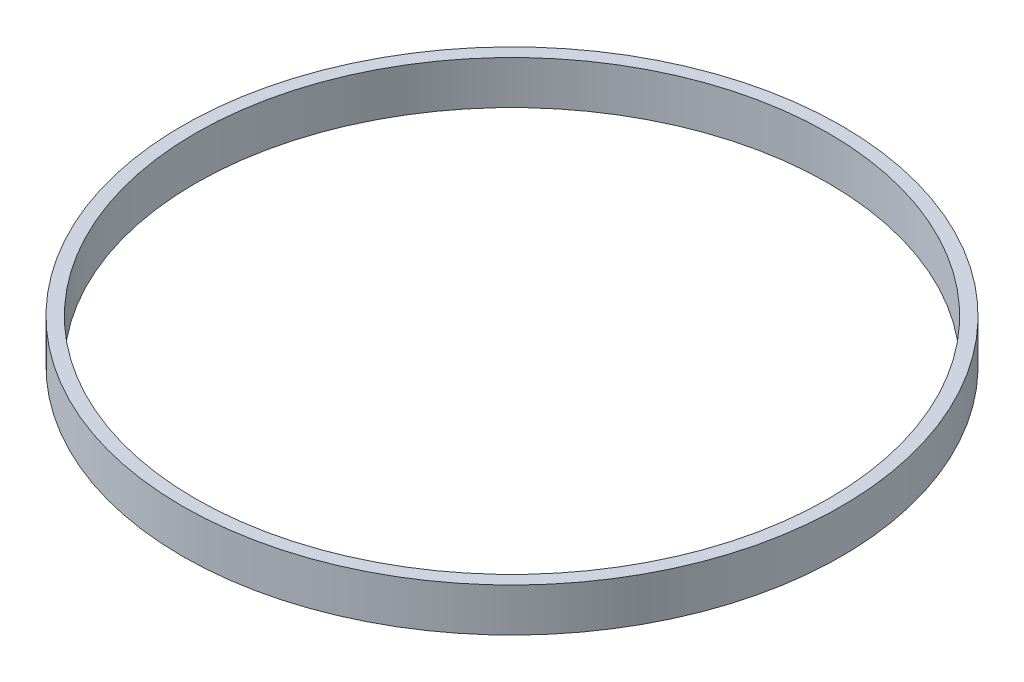
ISO-10303-21;
HEADER;
FILE_DESCRIPTION(('STEP AP214'),'2;1');
FILE_NAME('part.step','',(''),(''),'','','');
FILE_SCHEMA(('AUTOMOTIVE_DESIGN { 1 0 10303 214 1 1 1 1 }'));
ENDSEC;
DATA;
#1=APPLICATION_CONTEXT('core data for automotive mechanical design processes');
#2=APPLICATION_PROTOCOL_DEFINITION('international standard','automotive_design',2000,#1);
#3=PRODUCT_CONTEXT('',#1,'mechanical');
#4=PRODUCT('Part','Part','',(#3));
#5=PRODUCT_RELATED_PRODUCT_CATEGORY('part','',(#4));
#6=PRODUCT_DEFINITION_FORMATION('','',#4);
#7=PRODUCT_DEFINITION_CONTEXT('part definition',#1,'design');
#8=PRODUCT_DEFINITION('design','',#6,#7);
#9=PRODUCT_DEFINITION_SHAPE('','',#8);
#10=(LENGTH_UNIT() NAMED_UNIT(*) SI_UNIT(.MILLI.,.METRE.));
#11=(NAMED_UNIT(*) PLANE_ANGLE_UNIT() SI_UNIT($,.RADIAN.));
#12=(NAMED_UNIT(*) SI_UNIT($,.STERADIAN.) SOLID_ANGLE_UNIT());
#13=UNCERTAINTY_MEASURE_WITH_UNIT(LENGTH_MEASURE(1.E-05),#10,'distance_accuracy_value','');
#14=(GEOMETRIC_REPRESENTATION_CONTEXT(3) GLOBAL_UNCERTAINTY_ASSIGNED_CONTEXT((#13)) GLOBAL_UNIT_ASSIGNED_CONTEXT((#10,
#11,#12)) REPRESENTATION_CONTEXT('',''));
#15=CARTESIAN_POINT('',(0.,0.,0.));
#16=DIRECTION('',(0.,0.,1.));
#17=DIRECTION('',(1.,0.,0.));
#18=AXIS2_PLACEMENT_3D('',#15,#16,#17);
#19=CARTESIAN_POINT('',(0.,10.,0.));
#20=DIRECTION('',(0.,1.,0.));
#21=DIRECTION('',(0.,0.,1.));
#22=AXIS2_PLACEMENT_3D('',#19,#20,#21);
#23=PLANE('',#22);
#24=CARTESIAN_POINT('',(0.,10.,0.));
#25=DIRECTION('',(0.,1.,0.));
#26=DIRECTION('',(0.,0.,1.));
#27=AXIS2_PLACEMENT_3D('',#24,#25,#26);
#28=CIRCLE('',#27,76.);
#29=CARTESIAN_POINT('',(0.,10.,76.));
#30=VERTEX_POINT('',#29);
#31=EDGE_CURVE('E10',#30,#30,#28,.T.);
#32=ORIENTED_EDGE('',*,*,#31,.T.);
#33=EDGE_LOOP('',(#32));
#34=FACE_BOUND('',#33,.T.);
#35=CARTESIAN_POINT('',(0.,10.,0.));
#36=DIRECTION('',(0.,1.,0.));
#37=DIRECTION('',(0.,0.,1.));
#38=AXIS2_PLACEMENT_3D('',#35,#36,#37);
#39=CIRCLE('',#38,73.);
#40=CARTESIAN_POINT('',(0.,10.,73.));
#41=VERTEX_POINT('',#40);
#42=EDGE_CURVE('E42',#41,#41,#39,.T.);
#43=ORIENTED_EDGE('',*,*,#42,.F.);
#44=EDGE_LOOP('',(#43));
#45=FACE_BOUND('',#44,.T.);
#46=ADVANCED_FACE('F31',(#34,#45),#23,.T.);
#47=CARTESIAN_POINT('',(0.,0.,0.));
#48=DIRECTION('',(0.,1.,0.));
#49=DIRECTION('',(0.,0.,1.));
#50=AXIS2_PLACEMENT_3D('',#47,#48,#49);
#51=PLANE('',#50);
#52=CARTESIAN_POINT('',(0.,0.,0.));
#53=DIRECTION('',(0.,1.,0.));
#54=DIRECTION('',(0.,0.,1.));
#55=AXIS2_PLACEMENT_3D('',#52,#53,#54);
#56=CIRCLE('',#55,76.);
#57=CARTESIAN_POINT('',(0.,0.,76.));
#58=VERTEX_POINT('',#57);
#59=EDGE_CURVE('E35',#58,#58,#56,.T.);
#60=ORIENTED_EDGE('',*,*,#59,.F.);
#61=EDGE_LOOP('',(#60));
#62=FACE_BOUND('',#61,.T.);
#63=CARTESIAN_POINT('',(0.,0.,0.));
#64=DIRECTION('',(0.,1.,0.));
#65=DIRECTION('',(0.,0.,1.));
#66=AXIS2_PLACEMENT_3D('',#63,#64,#65);
#67=CIRCLE('',#66,73.);
#68=CARTESIAN_POINT('',(0.,0.,73.));
#69=VERTEX_POINT('',#68);
#70=EDGE_CURVE('E44',#69,#69,#67,.T.);
#71=ORIENTED_EDGE('',*,*,#70,.T.);
#72=EDGE_LOOP('',(#71));
#73=FACE_BOUND('',#72,.T.);
#74=ADVANCED_FACE('F54',(#62,#73),#51,.F.);
#75=CARTESIAN_POINT('',(0.,10.,0.));
#76=DIRECTION('',(0.,-1.,0.));
#77=DIRECTION('',(0.,0.,-1.));
#78=AXIS2_PLACEMENT_3D('',#75,#76,#77);
#79=CYLINDRICAL_SURFACE('',#78,76.);
#80=ORIENTED_EDGE('',*,*,#31,.F.);
#81=EDGE_LOOP('',(#80));
#82=FACE_BOUND('',#81,.T.);
#83=ORIENTED_EDGE('',*,*,#59,.T.);
#84=EDGE_LOOP('',(#83));
#85=FACE_BOUND('',#84,.T.);
#86=ADVANCED_FACE('F33',(#82,#85),#79,.T.);
#87=CARTESIAN_POINT('',(0.,10.,0.));
#88=DIRECTION('',(0.,-1.,0.));
#89=DIRECTION('',(0.,0.,-1.));
#90=AXIS2_PLACEMENT_3D('',#87,#88,#89);
#91=CYLINDRICAL_SURFACE('',#90,73.);
#92=ORIENTED_EDGE('',*,*,#42,.T.);
#93=EDGE_LOOP('',(#92));
#94=FACE_BOUND('',#93,.T.);
#95=ORIENTED_EDGE('',*,*,#70,.F.);
#96=EDGE_LOOP('',(#95));
#97=FACE_BOUND('',#96,.T.);
#98=ADVANCED_FACE('F50',(#94,#97),#91,.F.);
#99=CLOSED_SHELL('',(#46,#74,#86,#98));
#100=MANIFOLD_SOLID_BREP('B2',#99);
#101=ADVANCED_BREP_SHAPE_REPRESENTATION('',(#18,#100),#14);
#102=SHAPE_DEFINITION_REPRESENTATION(#9,#101);
ENDSEC;
END-ISO-10303-21;
